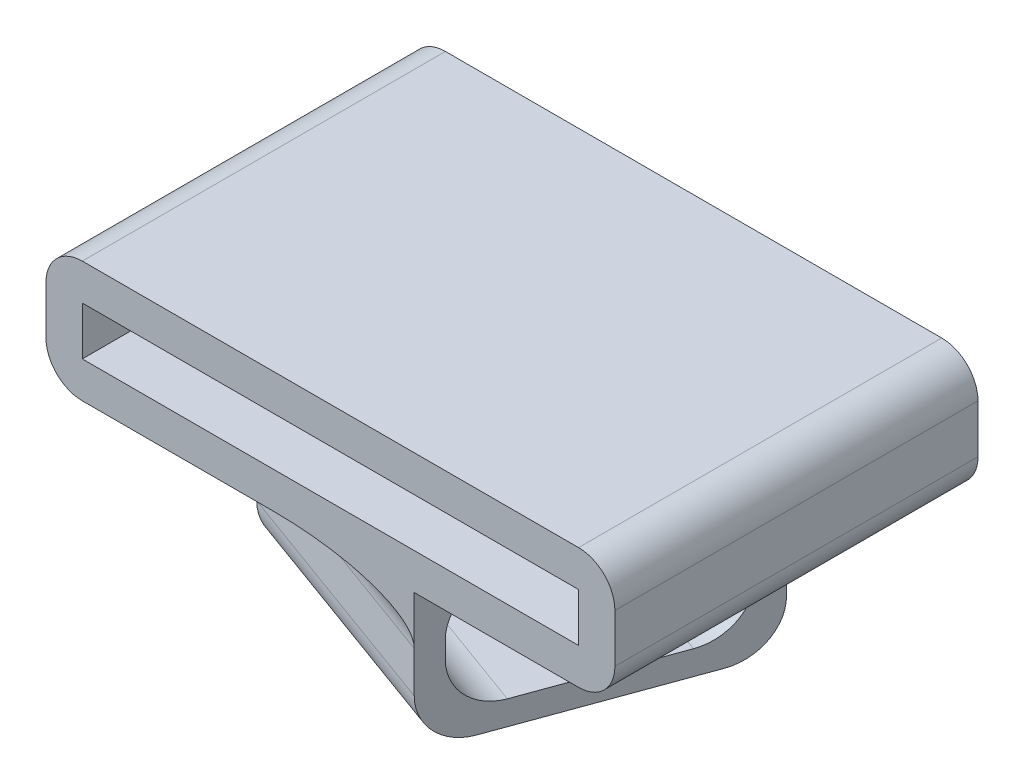
ISO-10303-21;
HEADER;
FILE_DESCRIPTION(('STEP AP214'),'2;1');
FILE_NAME('part.step','',(''),(''),'','','');
FILE_SCHEMA(('AUTOMOTIVE_DESIGN { 1 0 10303 214 1 1 1 1 }'));
ENDSEC;
DATA;
#1=APPLICATION_CONTEXT('core data for automotive mechanical design processes');
#2=APPLICATION_PROTOCOL_DEFINITION('international standard','automotive_design',2000,#1);
#3=PRODUCT_CONTEXT('',#1,'mechanical');
#4=PRODUCT('Part','Part','',(#3));
#5=PRODUCT_RELATED_PRODUCT_CATEGORY('part','',(#4));
#6=PRODUCT_DEFINITION_FORMATION('','',#4);
#7=PRODUCT_DEFINITION_CONTEXT('part definition',#1,'design');
#8=PRODUCT_DEFINITION('design','',#6,#7);
#9=PRODUCT_DEFINITION_SHAPE('','',#8);
#10=(LENGTH_UNIT() NAMED_UNIT(*) SI_UNIT(.MILLI.,.METRE.));
#11=(NAMED_UNIT(*) PLANE_ANGLE_UNIT() SI_UNIT($,.RADIAN.));
#12=(NAMED_UNIT(*) SI_UNIT($,.STERADIAN.) SOLID_ANGLE_UNIT());
#13=UNCERTAINTY_MEASURE_WITH_UNIT(LENGTH_MEASURE(1.E-05),#10,'distance_accuracy_value','');
#14=(GEOMETRIC_REPRESENTATION_CONTEXT(3) GLOBAL_UNCERTAINTY_ASSIGNED_CONTEXT((#13)) GLOBAL_UNIT_ASSIGNED_CONTEXT((#10,
#11,#12)) REPRESENTATION_CONTEXT('',''));
#15=CARTESIAN_POINT('',(0.,0.,0.));
#16=DIRECTION('',(0.,0.,1.));
#17=DIRECTION('',(1.,0.,0.));
#18=AXIS2_PLACEMENT_3D('',#15,#16,#17);
#19=CARTESIAN_POINT('',(1.5,-1.5,15.));
#20=DIRECTION('',(0.,1.,0.));
#21=DIRECTION('',(0.,0.,1.));
#22=AXIS2_PLACEMENT_3D('',#19,#20,#21);
#23=PLANE('',#22);
#24=DIRECTION('',(1.,0.,0.));
#25=VECTOR('',#24,1.);
#26=CARTESIAN_POINT('',(1.5,-1.5,0.));
#27=LINE('',#26,#25);
#28=CARTESIAN_POINT('',(-7.06692907088986,-1.5,0.));
#29=VERTEX_POINT('',#28);
#30=CARTESIAN_POINT('',(0.,-1.5,0.));
#31=VERTEX_POINT('',#30);
#32=EDGE_CURVE('E239',#29,#31,#27,.T.);
#33=ORIENTED_EDGE('',*,*,#32,.T.);
#34=DIRECTION('',(0.,0.,-1.));
#35=VECTOR('',#34,1.);
#36=CARTESIAN_POINT('',(0.,-1.5,15.));
#37=LINE('',#36,#35);
#38=CARTESIAN_POINT('',(0.,-1.5,15.));
#39=VERTEX_POINT('',#38);
#40=EDGE_CURVE('E435',#31,#39,#37,.F.);
#41=ORIENTED_EDGE('',*,*,#40,.T.);
#42=DIRECTION('',(1.,0.,0.));
#43=VECTOR('',#42,1.);
#44=CARTESIAN_POINT('',(1.5,-1.5,15.));
#45=LINE('',#44,#43);
#46=CARTESIAN_POINT('',(-6.7880293813537,-1.5,15.));
#47=VERTEX_POINT('',#46);
#48=EDGE_CURVE('E319',#47,#39,#45,.T.);
#49=ORIENTED_EDGE('',*,*,#48,.F.);
#50=DIRECTION('',(-0.342020143325666,0.,0.939692620785909));
#51=VECTOR('',#50,1.);
#52=CARTESIAN_POINT('',(-6.7880293813537,-1.5,15.));
#53=LINE('',#52,#51);
#54=CARTESIAN_POINT('',(-5.7619689513767,-1.5,12.1809221376423));
#55=VERTEX_POINT('',#54);
#56=EDGE_CURVE('E264',#55,#47,#53,.T.);
#57=ORIENTED_EDGE('',*,*,#56,.F.);
#58=DIRECTION('',(-0.939692620785909,0.,-0.342020143325666));
#59=VECTOR('',#58,1.);
#60=CARTESIAN_POINT('',(-15.9927191611471,-1.5,8.45723358707318));
#61=LINE('',#60,#59);
#62=CARTESIAN_POINT('',(-15.9927191611471,-1.5,8.45723358707318));
#63=VERTEX_POINT('',#62);
#64=EDGE_CURVE('E360',#55,#63,#61,.T.);
#65=ORIENTED_EDGE('',*,*,#64,.T.);
#66=DIRECTION('',(0.342020143325666,0.,-0.939692620785909));
#67=VECTOR('',#66,1.);
#68=CARTESIAN_POINT('',(-12.9145378712161,-1.5,0.));
#69=LINE('',#68,#67);
#70=CARTESIAN_POINT('',(-17.7028198777754,-1.5,13.1556966910027));
#71=VERTEX_POINT('',#70);
#72=EDGE_CURVE('E261',#71,#63,#69,.T.);
#73=ORIENTED_EDGE('',*,*,#72,.F.);
#74=DIRECTION('',(-0.939692620785909,0.,-0.342020143325666));
#75=VECTOR('',#74,1.);
#76=CARTESIAN_POINT('',(-7.47206966800503,-1.5,16.8793852415718));
#77=LINE('',#76,#75);
#78=CARTESIAN_POINT('',(-12.6356381816799,-1.5,15.));
#79=VERTEX_POINT('',#78);
#80=EDGE_CURVE('E357',#71,#79,#77,.F.);
#81=ORIENTED_EDGE('',*,*,#80,.T.);
#82=CARTESIAN_POINT('',(-20.5,-1.5,15.));
#83=VERTEX_POINT('',#82);
#84=EDGE_CURVE('E316',#83,#79,#45,.T.);
#85=ORIENTED_EDGE('',*,*,#84,.F.);
#86=DIRECTION('',(0.,0.,-1.));
#87=VECTOR('',#86,1.);
#88=CARTESIAN_POINT('',(-20.5,-1.5,15.));
#89=LINE('',#88,#87);
#90=CARTESIAN_POINT('',(-20.5,-1.5,0.));
#91=VERTEX_POINT('',#90);
#92=EDGE_CURVE('E236',#83,#91,#89,.T.);
#93=ORIENTED_EDGE('',*,*,#92,.T.);
#94=CARTESIAN_POINT('',(-12.9145378712161,-1.5,0.));
#95=VERTEX_POINT('',#94);
#96=EDGE_CURVE('E227',#91,#95,#27,.T.);
#97=ORIENTED_EDGE('',*,*,#96,.T.);
#98=CARTESIAN_POINT('',(-13.9405983011931,-1.5,2.81907786235773));
#99=VERTEX_POINT('',#98);
#100=EDGE_CURVE('E232',#99,#95,#69,.T.);
#101=ORIENTED_EDGE('',*,*,#100,.F.);
#102=DIRECTION('',(-0.939692620785909,0.,-0.342020143325666));
#103=VECTOR('',#102,1.);
#104=CARTESIAN_POINT('',(-3.70984809142271,-1.5,6.54276641292682));
#105=LINE('',#104,#103);
#106=CARTESIAN_POINT('',(-3.70984809142271,-1.5,6.54276641292682));
#107=VERTEX_POINT('',#106);
#108=EDGE_CURVE('E363',#99,#107,#105,.F.);
#109=ORIENTED_EDGE('',*,*,#108,.T.);
#110=CARTESIAN_POINT('',(-1.99974737479438,-1.5,1.84430330899727));
#111=VERTEX_POINT('',#110);
#112=EDGE_CURVE('E272',#111,#107,#53,.T.);
#113=ORIENTED_EDGE('',*,*,#112,.F.);
#114=DIRECTION('',(0.939692620785909,0.,0.342020143325666));
#115=VECTOR('',#114,1.);
#116=CARTESIAN_POINT('',(-12.2304975845648,-1.5,-1.87938524157182));
#117=LINE('',#116,#115);
#118=EDGE_CURVE('E365',#111,#29,#117,.F.);
#119=ORIENTED_EDGE('',*,*,#118,.T.);
#120=EDGE_LOOP('',(#33,#41,#49,#57,#65,#73,#81,#85,#93,#97,#101,#109,#113,#119));
#121=FACE_BOUND('',#120,.T.);
#122=ADVANCED_FACE('F35',(#121),#23,.F.);
#123=CARTESIAN_POINT('',(0.,0.,15.));
#124=DIRECTION('',(0.,0.,-1.));
#125=DIRECTION('',(-1.,0.,0.));
#126=AXIS2_PLACEMENT_3D('',#123,#124,#125);
#127=PLANE('',#126);
#128=DIRECTION('',(0.,1.,0.));
#129=VECTOR('',#128,1.);
#130=CARTESIAN_POINT('',(1.5,-1.5,15.));
#131=LINE('',#130,#129);
#132=CARTESIAN_POINT('',(1.5,0.,15.));
#133=VERTEX_POINT('',#132);
#134=CARTESIAN_POINT('',(1.5,2.,15.));
#135=VERTEX_POINT('',#134);
#136=EDGE_CURVE('E318',#133,#135,#131,.T.);
#137=ORIENTED_EDGE('',*,*,#136,.T.);
#138=CARTESIAN_POINT('',(0.,2.,15.));
#139=DIRECTION('',(0.,0.,-1.));
#140=DIRECTION('',(-1.,0.,0.));
#141=AXIS2_PLACEMENT_3D('',#138,#139,#140);
#142=CIRCLE('',#141,1.5);
#143=CARTESIAN_POINT('',(0.,3.5,15.));
#144=VERTEX_POINT('',#143);
#145=EDGE_CURVE('E432',#135,#144,#142,.F.);
#146=ORIENTED_EDGE('',*,*,#145,.T.);
#147=DIRECTION('',(-1.,0.,0.));
#148=VECTOR('',#147,1.);
#149=CARTESIAN_POINT('',(1.5,3.5,15.));
#150=LINE('',#149,#148);
#151=CARTESIAN_POINT('',(-20.5,3.5,15.));
#152=VERTEX_POINT('',#151);
#153=EDGE_CURVE('E322',#144,#152,#150,.T.);
#154=ORIENTED_EDGE('',*,*,#153,.T.);
#155=CARTESIAN_POINT('',(-20.5,2.,15.));
#156=DIRECTION('',(0.,0.,-1.));
#157=DIRECTION('',(-1.,0.,0.));
#158=AXIS2_PLACEMENT_3D('',#155,#156,#157);
#159=CIRCLE('',#158,1.5);
#160=CARTESIAN_POINT('',(-22.,2.,15.));
#161=VERTEX_POINT('',#160);
#162=EDGE_CURVE('E56',#152,#161,#159,.F.);
#163=ORIENTED_EDGE('',*,*,#162,.T.);
#164=DIRECTION('',(0.,-1.,0.));
#165=VECTOR('',#164,1.);
#166=CARTESIAN_POINT('',(-22.,-1.5,15.));
#167=LINE('',#166,#165);
#168=CARTESIAN_POINT('',(-22.,0.,15.));
#169=VERTEX_POINT('',#168);
#170=EDGE_CURVE('E324',#161,#169,#167,.T.);
#171=ORIENTED_EDGE('',*,*,#170,.T.);
#172=CARTESIAN_POINT('',(-20.5,0.,15.));
#173=DIRECTION('',(0.,0.,-1.));
#174=DIRECTION('',(-1.,0.,0.));
#175=AXIS2_PLACEMENT_3D('',#172,#173,#174);
#176=CIRCLE('',#175,1.5);
#177=EDGE_CURVE('E427',#169,#83,#176,.F.);
#178=ORIENTED_EDGE('',*,*,#177,.T.);
#179=ORIENTED_EDGE('',*,*,#84,.T.);
#180=CARTESIAN_POINT('',(-12.6356381816799,-3.5,15.));
#181=DIRECTION('',(0.,0.,-1.));
#182=DIRECTION('',(1.,0.,0.));
#183=AXIS2_PLACEMENT_3D('',#180,#181,#182);
#184=ELLIPSE('',#183,5.84760880032622,2.);
#185=CARTESIAN_POINT('',(-6.7880293813537,-3.5,15.));
#186=VERTEX_POINT('',#185);
#187=EDGE_CURVE('E254',#79,#186,#184,.T.);
#188=ORIENTED_EDGE('',*,*,#187,.T.);
#189=DIRECTION('',(0.,-1.,0.));
#190=VECTOR('',#189,1.);
#191=CARTESIAN_POINT('',(-6.7880293813537,-7.2,15.));
#192=LINE('',#191,#190);
#193=EDGE_CURVE('E253',#47,#186,#192,.T.);
#194=ORIENTED_EDGE('',*,*,#193,.F.);
#195=ORIENTED_EDGE('',*,*,#48,.T.);
#196=CARTESIAN_POINT('',(0.,0.,15.));
#197=DIRECTION('',(0.,0.,-1.));
#198=DIRECTION('',(-1.,0.,0.));
#199=AXIS2_PLACEMENT_3D('',#196,#197,#198);
#200=CIRCLE('',#199,1.5);
#201=EDGE_CURVE('E430',#39,#133,#200,.F.);
#202=ORIENTED_EDGE('',*,*,#201,.T.);
#203=EDGE_LOOP('',(#137,#146,#154,#163,#171,#178,#179,#188,#194,#195,#202));
#204=FACE_BOUND('',#203,.T.);
#205=DIRECTION('',(0.,1.,0.));
#206=VECTOR('',#205,1.);
#207=CARTESIAN_POINT('',(0.,0.,15.));
#208=LINE('',#207,#206);
#209=CARTESIAN_POINT('',(0.,0.,15.));
#210=VERTEX_POINT('',#209);
#211=CARTESIAN_POINT('',(0.,2.,15.));
#212=VERTEX_POINT('',#211);
#213=EDGE_CURVE('E286',#210,#212,#208,.T.);
#214=ORIENTED_EDGE('',*,*,#213,.F.);
#215=DIRECTION('',(1.,0.,0.));
#216=VECTOR('',#215,1.);
#217=CARTESIAN_POINT('',(0.,0.,15.));
#218=LINE('',#217,#216);
#219=CARTESIAN_POINT('',(-20.5,0.,15.));
#220=VERTEX_POINT('',#219);
#221=EDGE_CURVE('E294',#220,#210,#218,.T.);
#222=ORIENTED_EDGE('',*,*,#221,.F.);
#223=DIRECTION('',(0.,-1.,0.));
#224=VECTOR('',#223,1.);
#225=CARTESIAN_POINT('',(-20.5,0.,15.));
#226=LINE('',#225,#224);
#227=CARTESIAN_POINT('',(-20.5,2.,15.));
#228=VERTEX_POINT('',#227);
#229=EDGE_CURVE('E291',#228,#220,#226,.T.);
#230=ORIENTED_EDGE('',*,*,#229,.F.);
#231=DIRECTION('',(-1.,0.,0.));
#232=VECTOR('',#231,1.);
#233=CARTESIAN_POINT('',(0.,2.,15.));
#234=LINE('',#233,#232);
#235=EDGE_CURVE('E288',#212,#228,#234,.T.);
#236=ORIENTED_EDGE('',*,*,#235,.F.);
#237=EDGE_LOOP('',(#214,#222,#230,#236));
#238=FACE_BOUND('',#237,.T.);
#239=ADVANCED_FACE('F441',(#204,#238),#127,.F.);
#240=CARTESIAN_POINT('',(0.,0.,0.));
#241=DIRECTION('',(0.,0.,-1.));
#242=DIRECTION('',(-1.,0.,0.));
#243=AXIS2_PLACEMENT_3D('',#240,#241,#242);
#244=PLANE('',#243);
#245=DIRECTION('',(-1.,0.,0.));
#246=VECTOR('',#245,1.);
#247=CARTESIAN_POINT('',(1.5,3.5,0.));
#248=LINE('',#247,#246);
#249=CARTESIAN_POINT('',(0.,3.5,0.));
#250=VERTEX_POINT('',#249);
#251=CARTESIAN_POINT('',(-20.5,3.5,0.));
#252=VERTEX_POINT('',#251);
#253=EDGE_CURVE('E329',#250,#252,#248,.T.);
#254=ORIENTED_EDGE('',*,*,#253,.F.);
#255=CARTESIAN_POINT('',(0.,2.,0.));
#256=DIRECTION('',(0.,0.,-1.));
#257=DIRECTION('',(-1.,0.,0.));
#258=AXIS2_PLACEMENT_3D('',#255,#256,#257);
#259=CIRCLE('',#258,1.5);
#260=CARTESIAN_POINT('',(1.5,2.,0.));
#261=VERTEX_POINT('',#260);
#262=EDGE_CURVE('E420',#250,#261,#259,.T.);
#263=ORIENTED_EDGE('',*,*,#262,.T.);
#264=DIRECTION('',(0.,1.,0.));
#265=VECTOR('',#264,1.);
#266=CARTESIAN_POINT('',(1.5,-1.5,0.));
#267=LINE('',#266,#265);
#268=CARTESIAN_POINT('',(1.5,0.,0.));
#269=VERTEX_POINT('',#268);
#270=EDGE_CURVE('E238',#269,#261,#267,.T.);
#271=ORIENTED_EDGE('',*,*,#270,.F.);
#272=CARTESIAN_POINT('',(0.,0.,0.));
#273=DIRECTION('',(0.,0.,-1.));
#274=DIRECTION('',(-1.,0.,0.));
#275=AXIS2_PLACEMENT_3D('',#272,#273,#274);
#276=CIRCLE('',#275,1.5);
#277=EDGE_CURVE('E418',#269,#31,#276,.T.);
#278=ORIENTED_EDGE('',*,*,#277,.T.);
#279=ORIENTED_EDGE('',*,*,#32,.F.);
#280=CARTESIAN_POINT('',(-7.06692907088986,-3.5,0.));
#281=DIRECTION('',(0.,0.,-1.));
#282=DIRECTION('',(-1.,0.,0.));
#283=AXIS2_PLACEMENT_3D('',#280,#281,#282);
#284=ELLIPSE('',#283,5.84760880032622,2.);
#285=CARTESIAN_POINT('',(-12.9145378712161,-3.5,0.));
#286=VERTEX_POINT('',#285);
#287=EDGE_CURVE('E249',#29,#286,#284,.F.);
#288=ORIENTED_EDGE('',*,*,#287,.T.);
#289=DIRECTION('',(0.,-1.,0.));
#290=VECTOR('',#289,1.);
#291=CARTESIAN_POINT('',(-12.9145378712161,0.,0.));
#292=LINE('',#291,#290);
#293=EDGE_CURVE('E243',#95,#286,#292,.T.);
#294=ORIENTED_EDGE('',*,*,#293,.F.);
#295=ORIENTED_EDGE('',*,*,#96,.F.);
#296=CARTESIAN_POINT('',(-20.5,0.,0.));
#297=DIRECTION('',(0.,0.,-1.));
#298=DIRECTION('',(-1.,0.,0.));
#299=AXIS2_PLACEMENT_3D('',#296,#297,#298);
#300=CIRCLE('',#299,1.5);
#301=CARTESIAN_POINT('',(-22.,0.,0.));
#302=VERTEX_POINT('',#301);
#303=EDGE_CURVE('E414',#91,#302,#300,.T.);
#304=ORIENTED_EDGE('',*,*,#303,.T.);
#305=DIRECTION('',(0.,-1.,0.));
#306=VECTOR('',#305,1.);
#307=CARTESIAN_POINT('',(-22.,-1.5,0.));
#308=LINE('',#307,#306);
#309=CARTESIAN_POINT('',(-22.,2.,0.));
#310=VERTEX_POINT('',#309);
#311=EDGE_CURVE('E332',#310,#302,#308,.T.);
#312=ORIENTED_EDGE('',*,*,#311,.F.);
#313=CARTESIAN_POINT('',(-20.5,2.,0.));
#314=DIRECTION('',(0.,0.,-1.));
#315=DIRECTION('',(-1.,0.,0.));
#316=AXIS2_PLACEMENT_3D('',#313,#314,#315);
#317=CIRCLE('',#316,1.5);
#318=EDGE_CURVE('E416',#310,#252,#317,.T.);
#319=ORIENTED_EDGE('',*,*,#318,.T.);
#320=EDGE_LOOP('',(#254,#263,#271,#278,#279,#288,#294,#295,#304,#312,#319));
#321=FACE_BOUND('',#320,.T.);
#322=DIRECTION('',(1.,0.,0.));
#323=VECTOR('',#322,1.);
#324=CARTESIAN_POINT('',(0.,0.,0.));
#325=LINE('',#324,#323);
#326=CARTESIAN_POINT('',(-20.5,0.,0.));
#327=VERTEX_POINT('',#326);
#328=CARTESIAN_POINT('',(0.,0.,0.));
#329=VERTEX_POINT('',#328);
#330=EDGE_CURVE('E289',#327,#329,#325,.T.);
#331=ORIENTED_EDGE('',*,*,#330,.T.);
#332=DIRECTION('',(0.,1.,0.));
#333=VECTOR('',#332,1.);
#334=CARTESIAN_POINT('',(0.,0.,0.));
#335=LINE('',#334,#333);
#336=CARTESIAN_POINT('',(0.,2.,0.));
#337=VERTEX_POINT('',#336);
#338=EDGE_CURVE('E285',#329,#337,#335,.T.);
#339=ORIENTED_EDGE('',*,*,#338,.T.);
#340=DIRECTION('',(-1.,0.,0.));
#341=VECTOR('',#340,1.);
#342=CARTESIAN_POINT('',(0.,2.,0.));
#343=LINE('',#342,#341);
#344=CARTESIAN_POINT('',(-20.5,2.,0.));
#345=VERTEX_POINT('',#344);
#346=EDGE_CURVE('E299',#337,#345,#343,.T.);
#347=ORIENTED_EDGE('',*,*,#346,.T.);
#348=DIRECTION('',(0.,-1.,0.));
#349=VECTOR('',#348,1.);
#350=CARTESIAN_POINT('',(-20.5,0.,0.));
#351=LINE('',#350,#349);
#352=EDGE_CURVE('E302',#345,#327,#351,.T.);
#353=ORIENTED_EDGE('',*,*,#352,.T.);
#354=EDGE_LOOP('',(#331,#339,#347,#353));
#355=FACE_BOUND('',#354,.T.);
#356=ADVANCED_FACE('F245',(#321,#355),#244,.T.);
#357=CARTESIAN_POINT('',(1.5,-1.5,15.));
#358=DIRECTION('',(-1.,0.,0.));
#359=DIRECTION('',(0.,0.,1.));
#360=AXIS2_PLACEMENT_3D('',#357,#358,#359);
#361=PLANE('',#360);
#362=ORIENTED_EDGE('',*,*,#270,.T.);
#363=DIRECTION('',(0.,0.,-1.));
#364=VECTOR('',#363,1.);
#365=CARTESIAN_POINT('',(1.5,2.,15.));
#366=LINE('',#365,#364);
#367=EDGE_CURVE('E425',#261,#135,#366,.F.);
#368=ORIENTED_EDGE('',*,*,#367,.T.);
#369=ORIENTED_EDGE('',*,*,#136,.F.);
#370=DIRECTION('',(0.,0.,-1.));
#371=VECTOR('',#370,1.);
#372=CARTESIAN_POINT('',(1.5,0.,15.));
#373=LINE('',#372,#371);
#374=EDGE_CURVE('E422',#133,#269,#373,.T.);
#375=ORIENTED_EDGE('',*,*,#374,.T.);
#376=EDGE_LOOP('',(#362,#368,#369,#375));
#377=FACE_BOUND('',#376,.T.);
#378=ADVANCED_FACE('F449',(#377),#361,.F.);
#379=CARTESIAN_POINT('',(1.5,3.5,15.));
#380=DIRECTION('',(0.,-1.,0.));
#381=DIRECTION('',(1.,0.,0.));
#382=AXIS2_PLACEMENT_3D('',#379,#380,#381);
#383=PLANE('',#382);
#384=ORIENTED_EDGE('',*,*,#153,.F.);
#385=DIRECTION('',(0.,0.,-1.));
#386=VECTOR('',#385,1.);
#387=CARTESIAN_POINT('',(0.,3.5,15.));
#388=LINE('',#387,#386);
#389=EDGE_CURVE('E411',#144,#250,#388,.T.);
#390=ORIENTED_EDGE('',*,*,#389,.T.);
#391=ORIENTED_EDGE('',*,*,#253,.T.);
#392=DIRECTION('',(0.,0.,-1.));
#393=VECTOR('',#392,1.);
#394=CARTESIAN_POINT('',(-20.5,3.5,15.));
#395=LINE('',#394,#393);
#396=EDGE_CURVE('E409',#252,#152,#395,.F.);
#397=ORIENTED_EDGE('',*,*,#396,.T.);
#398=EDGE_LOOP('',(#384,#390,#391,#397));
#399=FACE_BOUND('',#398,.T.);
#400=ADVANCED_FACE('F457',(#399),#383,.F.);
#401=CARTESIAN_POINT('',(-22.,-1.5,15.));
#402=DIRECTION('',(1.,0.,0.));
#403=DIRECTION('',(0.,0.,-1.));
#404=AXIS2_PLACEMENT_3D('',#401,#402,#403);
#405=PLANE('',#404);
#406=ORIENTED_EDGE('',*,*,#170,.F.);
#407=DIRECTION('',(0.,0.,-1.));
#408=VECTOR('',#407,1.);
#409=CARTESIAN_POINT('',(-22.,2.,15.));
#410=LINE('',#409,#408);
#411=EDGE_CURVE('E11',#161,#310,#410,.T.);
#412=ORIENTED_EDGE('',*,*,#411,.T.);
#413=ORIENTED_EDGE('',*,*,#311,.T.);
#414=DIRECTION('',(0.,0.,-1.));
#415=VECTOR('',#414,1.);
#416=CARTESIAN_POINT('',(-22.,0.,15.));
#417=LINE('',#416,#415);
#418=EDGE_CURVE('E43',#302,#169,#417,.F.);
#419=ORIENTED_EDGE('',*,*,#418,.T.);
#420=EDGE_LOOP('',(#406,#412,#413,#419));
#421=FACE_BOUND('',#420,.T.);
#422=ADVANCED_FACE('F463',(#421),#405,.F.);
#423=CARTESIAN_POINT('',(0.,0.,15.));
#424=DIRECTION('',(-1.,0.,0.));
#425=DIRECTION('',(0.,-1.,0.));
#426=AXIS2_PLACEMENT_3D('',#423,#424,#425);
#427=PLANE('',#426);
#428=ORIENTED_EDGE('',*,*,#338,.F.);
#429=DIRECTION('',(0.,0.,-1.));
#430=VECTOR('',#429,1.);
#431=CARTESIAN_POINT('',(0.,0.,15.));
#432=LINE('',#431,#430);
#433=EDGE_CURVE('E296',#210,#329,#432,.T.);
#434=ORIENTED_EDGE('',*,*,#433,.F.);
#435=ORIENTED_EDGE('',*,*,#213,.T.);
#436=DIRECTION('',(0.,0.,-1.));
#437=VECTOR('',#436,1.);
#438=CARTESIAN_POINT('',(0.,2.,15.));
#439=LINE('',#438,#437);
#440=EDGE_CURVE('E313',#212,#337,#439,.T.);
#441=ORIENTED_EDGE('',*,*,#440,.T.);
#442=EDGE_LOOP('',(#428,#434,#435,#441));
#443=FACE_BOUND('',#442,.T.);
#444=ADVANCED_FACE('F594',(#443),#427,.T.);
#445=CARTESIAN_POINT('',(0.,2.,15.));
#446=DIRECTION('',(0.,-1.,0.));
#447=DIRECTION('',(1.,0.,0.));
#448=AXIS2_PLACEMENT_3D('',#445,#446,#447);
#449=PLANE('',#448);
#450=ORIENTED_EDGE('',*,*,#346,.F.);
#451=ORIENTED_EDGE('',*,*,#440,.F.);
#452=ORIENTED_EDGE('',*,*,#235,.T.);
#453=DIRECTION('',(0.,0.,-1.));
#454=VECTOR('',#453,1.);
#455=CARTESIAN_POINT('',(-20.5,2.,15.));
#456=LINE('',#455,#454);
#457=EDGE_CURVE('E311',#228,#345,#456,.T.);
#458=ORIENTED_EDGE('',*,*,#457,.T.);
#459=EDGE_LOOP('',(#450,#451,#452,#458));
#460=FACE_BOUND('',#459,.T.);
#461=ADVANCED_FACE('F753',(#460),#449,.T.);
#462=CARTESIAN_POINT('',(-20.5,0.,15.));
#463=DIRECTION('',(1.,0.,0.));
#464=DIRECTION('',(0.,0.,-1.));
#465=AXIS2_PLACEMENT_3D('',#462,#463,#464);
#466=PLANE('',#465);
#467=ORIENTED_EDGE('',*,*,#352,.F.);
#468=ORIENTED_EDGE('',*,*,#457,.F.);
#469=ORIENTED_EDGE('',*,*,#229,.T.);
#470=DIRECTION('',(0.,0.,-1.));
#471=VECTOR('',#470,1.);
#472=CARTESIAN_POINT('',(-20.5,0.,15.));
#473=LINE('',#472,#471);
#474=EDGE_CURVE('E309',#220,#327,#473,.T.);
#475=ORIENTED_EDGE('',*,*,#474,.T.);
#476=EDGE_LOOP('',(#467,#468,#469,#475));
#477=FACE_BOUND('',#476,.T.);
#478=ADVANCED_FACE('F520',(#477),#466,.T.);
#479=CARTESIAN_POINT('',(0.,0.,15.));
#480=DIRECTION('',(0.,1.,0.));
#481=DIRECTION('',(-1.,0.,0.));
#482=AXIS2_PLACEMENT_3D('',#479,#480,#481);
#483=PLANE('',#482);
#484=ORIENTED_EDGE('',*,*,#330,.F.);
#485=ORIENTED_EDGE('',*,*,#474,.F.);
#486=ORIENTED_EDGE('',*,*,#221,.T.);
#487=ORIENTED_EDGE('',*,*,#433,.T.);
#488=EDGE_LOOP('',(#484,#485,#486,#487));
#489=FACE_BOUND('',#488,.T.);
#490=ADVANCED_FACE('F512',(#489),#483,.T.);
#491=CARTESIAN_POINT('',(-17.0187795911241,-7.2,11.2763114494309));
#492=DIRECTION('',(0.342020143325666,0.,-0.939692620785909));
#493=DIRECTION('',(-0.939692620785909,0.,-0.342020143325666));
#494=AXIS2_PLACEMENT_3D('',#491,#492,#493);
#495=PLANE('',#494);
#496=DIRECTION('',(0.,1.,0.));
#497=VECTOR('',#496,1.);
#498=CARTESIAN_POINT('',(-17.0187795911241,-7.2,11.2763114494309));
#499=LINE('',#498,#497);
#500=CARTESIAN_POINT('',(-17.0187795911241,-5.2,11.2763114494309));
#501=VERTEX_POINT('',#500);
#502=CARTESIAN_POINT('',(-17.0187795911241,-3.5,11.2763114494309));
#503=VERTEX_POINT('',#502);
#504=EDGE_CURVE('E282',#501,#503,#499,.T.);
#505=ORIENTED_EDGE('',*,*,#504,.F.);
#506=DIRECTION('',(-0.939692620785909,0.,-0.342020143325666));
#507=VECTOR('',#506,1.);
#508=CARTESIAN_POINT('',(-17.0187795911241,-5.2,11.2763114494309));
#509=LINE('',#508,#507);
#510=CARTESIAN_POINT('',(-6.7880293813537,-5.2,15.));
#511=VERTEX_POINT('',#510);
#512=EDGE_CURVE('E346',#501,#511,#509,.F.);
#513=ORIENTED_EDGE('',*,*,#512,.T.);
#514=DIRECTION('',(0.,1.,0.));
#515=VECTOR('',#514,1.);
#516=CARTESIAN_POINT('',(-6.7880293813537,-7.2,15.));
#517=LINE('',#516,#515);
#518=EDGE_CURVE('E275',#511,#186,#517,.T.);
#519=ORIENTED_EDGE('',*,*,#518,.T.);
#520=DIRECTION('',(-0.939692620785909,0.,-0.342020143325666));
#521=VECTOR('',#520,1.);
#522=CARTESIAN_POINT('',(-17.0187795911241,-3.5,11.2763114494309));
#523=LINE('',#522,#521);
#524=EDGE_CURVE('E343',#186,#503,#523,.T.);
#525=ORIENTED_EDGE('',*,*,#524,.T.);
#526=EDGE_LOOP('',(#505,#513,#519,#525));
#527=FACE_BOUND('',#526,.T.);
#528=ADVANCED_FACE('F510',(#527),#495,.F.);
#529=CARTESIAN_POINT('',(-12.9145378712161,-7.2,0.));
#530=DIRECTION('',(0.939692620785909,0.,0.342020143325666));
#531=DIRECTION('',(0.342020143325666,0.,-0.939692620785909));
#532=AXIS2_PLACEMENT_3D('',#529,#530,#531);
#533=PLANE('',#532);
#534=DIRECTION('',(0.342020143325666,0.,-0.939692620785909));
#535=VECTOR('',#534,1.);
#536=CARTESIAN_POINT('',(-12.9145378712161,-7.2,0.));
#537=LINE('',#536,#535);
#538=CARTESIAN_POINT('',(-16.3347393044727,-7.2,9.39692620785909));
#539=VERTEX_POINT('',#538);
#540=CARTESIAN_POINT('',(-13.5985781578674,-7.2,1.87938524157182));
#541=VERTEX_POINT('',#540);
#542=EDGE_CURVE('E274',#539,#541,#537,.T.);
#543=ORIENTED_EDGE('',*,*,#542,.F.);
#544=CARTESIAN_POINT('',(-16.3347393044727,-5.2,9.39692620785909));
#545=DIRECTION('',(0.939692620785909,0.,0.342020143325666));
#546=DIRECTION('',(0.342020143325666,0.,-0.939692620785909));
#547=AXIS2_PLACEMENT_3D('',#544,#545,#546);
#548=CIRCLE('',#547,2.);
#549=EDGE_CURVE('E341',#539,#501,#548,.F.);
#550=ORIENTED_EDGE('',*,*,#549,.T.);
#551=ORIENTED_EDGE('',*,*,#504,.T.);
#552=CARTESIAN_POINT('',(-17.7028198777754,-3.5,13.1556966910027));
#553=DIRECTION('',(0.939692620785909,0.,0.342020143325666));
#554=DIRECTION('',(0.342020143325666,0.,-0.939692620785909));
#555=AXIS2_PLACEMENT_3D('',#552,#553,#554);
#556=CIRCLE('',#555,2.);
#557=EDGE_CURVE('E402',#503,#71,#556,.T.);
#558=ORIENTED_EDGE('',*,*,#557,.T.);
#559=ORIENTED_EDGE('',*,*,#72,.T.);
#560=CARTESIAN_POINT('',(-15.9927191611471,-3.5,8.45723358707318));
#561=DIRECTION('',(0.939692620785909,0.,0.342020143325666));
#562=DIRECTION('',(0.342020143325666,0.,-0.939692620785909));
#563=AXIS2_PLACEMENT_3D('',#560,#561,#562);
#564=CIRCLE('',#563,2.);
#565=CARTESIAN_POINT('',(-16.6767594477984,-3.5,10.336618828645));
#566=VERTEX_POINT('',#565);
#567=EDGE_CURVE('E397',#63,#566,#564,.T.);
#568=ORIENTED_EDGE('',*,*,#567,.T.);
#569=DIRECTION('',(0.,1.,0.));
#570=VECTOR('',#569,1.);
#571=CARTESIAN_POINT('',(-16.6767594477984,-6.2,10.336618828645));
#572=LINE('',#571,#570);
#573=CARTESIAN_POINT('',(-16.6767594477984,-4.2,10.336618828645));
#574=VERTEX_POINT('',#573);
#575=EDGE_CURVE('E484',#574,#566,#572,.T.);
#576=ORIENTED_EDGE('',*,*,#575,.F.);
#577=CARTESIAN_POINT('',(-15.9927191611471,-4.2,8.45723358707318));
#578=DIRECTION('',(0.939692620785909,0.,0.342020143325666));
#579=DIRECTION('',(0.342020143325666,0.,-0.939692620785909));
#580=AXIS2_PLACEMENT_3D('',#577,#578,#579);
#581=CIRCLE('',#580,2.);
#582=CARTESIAN_POINT('',(-15.9927191611471,-6.2,8.45723358707318));
#583=VERTEX_POINT('',#582);
#584=EDGE_CURVE('E390',#574,#583,#581,.T.);
#585=ORIENTED_EDGE('',*,*,#584,.T.);
#586=DIRECTION('',(-0.342020143325666,0.,0.939692620785909));
#587=VECTOR('',#586,1.);
#588=CARTESIAN_POINT('',(-16.6767594477984,-6.2,10.336618828645));
#589=LINE('',#588,#587);
#590=CARTESIAN_POINT('',(-13.9405983011931,-6.2,2.81907786235773));
#591=VERTEX_POINT('',#590);
#592=EDGE_CURVE('E492',#591,#583,#589,.T.);
#593=ORIENTED_EDGE('',*,*,#592,.F.);
#594=CARTESIAN_POINT('',(-13.9405983011931,-4.2,2.81907786235773));
#595=DIRECTION('',(0.939692620785909,0.,0.342020143325666));
#596=DIRECTION('',(0.342020143325666,0.,-0.939692620785909));
#597=AXIS2_PLACEMENT_3D('',#594,#595,#596);
#598=CIRCLE('',#597,2.);
#599=CARTESIAN_POINT('',(-13.2565580145418,-4.2,0.939692620785909));
#600=VERTEX_POINT('',#599);
#601=EDGE_CURVE('E386',#591,#600,#598,.T.);
#602=ORIENTED_EDGE('',*,*,#601,.T.);
#603=DIRECTION('',(0.,-1.,0.));
#604=VECTOR('',#603,1.);
#605=CARTESIAN_POINT('',(-13.2565580145418,-6.2,0.939692620785909));
#606=LINE('',#605,#604);
#607=CARTESIAN_POINT('',(-13.2565580145418,-3.5,0.939692620785909));
#608=VERTEX_POINT('',#607);
#609=EDGE_CURVE('E489',#608,#600,#606,.T.);
#610=ORIENTED_EDGE('',*,*,#609,.F.);
#611=CARTESIAN_POINT('',(-13.9405983011931,-3.5,2.81907786235773));
#612=DIRECTION('',(0.939692620785909,0.,0.342020143325666));
#613=DIRECTION('',(0.342020143325666,0.,-0.939692620785909));
#614=AXIS2_PLACEMENT_3D('',#611,#612,#613);
#615=CIRCLE('',#614,2.);
#616=EDGE_CURVE('E259',#608,#99,#615,.T.);
#617=ORIENTED_EDGE('',*,*,#616,.T.);
#618=ORIENTED_EDGE('',*,*,#100,.T.);
#619=ORIENTED_EDGE('',*,*,#293,.T.);
#620=DIRECTION('',(0.,1.,0.));
#621=VECTOR('',#620,1.);
#622=CARTESIAN_POINT('',(-12.9145378712161,-7.2,0.));
#623=LINE('',#622,#621);
#624=CARTESIAN_POINT('',(-12.9145378712161,-5.2,0.));
#625=VERTEX_POINT('',#624);
#626=EDGE_CURVE('E280',#625,#286,#623,.T.);
#627=ORIENTED_EDGE('',*,*,#626,.F.);
#628=CARTESIAN_POINT('',(-13.5985781578674,-5.2,1.87938524157182));
#629=DIRECTION('',(0.939692620785909,0.,0.342020143325666));
#630=DIRECTION('',(0.342020143325666,0.,-0.939692620785909));
#631=AXIS2_PLACEMENT_3D('',#628,#629,#630);
#632=CIRCLE('',#631,2.);
#633=EDGE_CURVE('E339',#625,#541,#632,.F.);
#634=ORIENTED_EDGE('',*,*,#633,.T.);
#635=EDGE_LOOP('',(#543,#550,#551,#558,#559,#568,#576,#585,#593,#602,#610,#617,#618,#619,#627,#634));
#636=FACE_BOUND('',#635,.T.);
#637=ADVANCED_FACE('F257',(#636),#533,.F.);
#638=CARTESIAN_POINT('',(-2.68378766144571,-7.2,3.72368855056909));
#639=DIRECTION('',(-0.342020143325666,0.,0.939692620785909));
#640=DIRECTION('',(0.939692620785909,0.,0.342020143325666));
#641=AXIS2_PLACEMENT_3D('',#638,#639,#640);
#642=PLANE('',#641);
#643=DIRECTION('',(0.,1.,0.));
#644=VECTOR('',#643,1.);
#645=CARTESIAN_POINT('',(-2.68378766144571,-7.2,3.72368855056909));
#646=LINE('',#645,#644);
#647=CARTESIAN_POINT('',(-2.68378766144571,-5.2,3.72368855056909));
#648=VERTEX_POINT('',#647);
#649=CARTESIAN_POINT('',(-2.68378766144571,-3.5,3.72368855056909));
#650=VERTEX_POINT('',#649);
#651=EDGE_CURVE('E277',#648,#650,#646,.T.);
#652=ORIENTED_EDGE('',*,*,#651,.F.);
#653=DIRECTION('',(0.939692620785909,0.,0.342020143325666));
#654=VECTOR('',#653,1.);
#655=CARTESIAN_POINT('',(-2.68378766144571,-5.2,3.72368855056909));
#656=LINE('',#655,#654);
#657=EDGE_CURVE('E355',#648,#625,#656,.F.);
#658=ORIENTED_EDGE('',*,*,#657,.T.);
#659=ORIENTED_EDGE('',*,*,#626,.T.);
#660=DIRECTION('',(0.939692620785909,0.,0.342020143325666));
#661=VECTOR('',#660,1.);
#662=CARTESIAN_POINT('',(-2.68378766144571,-3.5,3.72368855056909));
#663=LINE('',#662,#661);
#664=EDGE_CURVE('E352',#286,#650,#663,.T.);
#665=ORIENTED_EDGE('',*,*,#664,.T.);
#666=EDGE_LOOP('',(#652,#658,#659,#665));
#667=FACE_BOUND('',#666,.T.);
#668=ADVANCED_FACE('F518',(#667),#642,.F.);
#669=CARTESIAN_POINT('',(-6.7880293813537,-7.2,15.));
#670=DIRECTION('',(-0.939692620785909,0.,-0.342020143325666));
#671=DIRECTION('',(-0.342020143325666,0.,0.93969262078591));
#672=AXIS2_PLACEMENT_3D('',#669,#670,#671);
#673=PLANE('',#672);
#674=ORIENTED_EDGE('',*,*,#518,.F.);
#675=CARTESIAN_POINT('',(-6.10398909470237,-5.2,13.1206147584282));
#676=DIRECTION('',(-0.939692620785909,0.,-0.342020143325666));
#677=DIRECTION('',(-0.342020143325666,0.,0.93969262078591));
#678=AXIS2_PLACEMENT_3D('',#675,#676,#677);
#679=CIRCLE('',#678,2.);
#680=CARTESIAN_POINT('',(-6.10398909470237,-7.2,13.1206147584282));
#681=VERTEX_POINT('',#680);
#682=EDGE_CURVE('E350',#511,#681,#679,.F.);
#683=ORIENTED_EDGE('',*,*,#682,.T.);
#684=DIRECTION('',(-0.342020143325666,0.,0.939692620785909));
#685=VECTOR('',#684,1.);
#686=CARTESIAN_POINT('',(-6.7880293813537,-7.2,15.));
#687=LINE('',#686,#685);
#688=CARTESIAN_POINT('',(-3.36782794809704,-7.2,5.60307379214091));
#689=VERTEX_POINT('',#688);
#690=EDGE_CURVE('E270',#689,#681,#687,.T.);
#691=ORIENTED_EDGE('',*,*,#690,.F.);
#692=CARTESIAN_POINT('',(-3.36782794809704,-5.2,5.60307379214091));
#693=DIRECTION('',(-0.939692620785909,0.,-0.342020143325666));
#694=DIRECTION('',(-0.342020143325666,0.,0.93969262078591));
#695=AXIS2_PLACEMENT_3D('',#692,#693,#694);
#696=CIRCLE('',#695,2.);
#697=EDGE_CURVE('E348',#689,#648,#696,.F.);
#698=ORIENTED_EDGE('',*,*,#697,.T.);
#699=ORIENTED_EDGE('',*,*,#651,.T.);
#700=CARTESIAN_POINT('',(-1.99974737479438,-3.5,1.84430330899727));
#701=DIRECTION('',(-0.939692620785909,0.,-0.342020143325666));
#702=DIRECTION('',(-0.342020143325666,0.,0.93969262078591));
#703=AXIS2_PLACEMENT_3D('',#700,#701,#702);
#704=CIRCLE('',#703,2.);
#705=EDGE_CURVE('E382',#650,#111,#704,.T.);
#706=ORIENTED_EDGE('',*,*,#705,.T.);
#707=ORIENTED_EDGE('',*,*,#112,.T.);
#708=CARTESIAN_POINT('',(-3.70984809142271,-3.5,6.54276641292682));
#709=DIRECTION('',(-0.939692620785909,0.,-0.342020143325666));
#710=DIRECTION('',(-0.342020143325666,0.,0.93969262078591));
#711=AXIS2_PLACEMENT_3D('',#708,#709,#710);
#712=CIRCLE('',#711,2.);
#713=CARTESIAN_POINT('',(-3.02580780477137,-3.5,4.663381171355));
#714=VERTEX_POINT('',#713);
#715=EDGE_CURVE('E395',#107,#714,#712,.T.);
#716=ORIENTED_EDGE('',*,*,#715,.T.);
#717=DIRECTION('',(0.,-1.,0.));
#718=VECTOR('',#717,1.);
#719=CARTESIAN_POINT('',(-3.02580780477137,-6.2,4.663381171355));
#720=LINE('',#719,#718);
#721=CARTESIAN_POINT('',(-3.02580780477137,-4.2,4.663381171355));
#722=VERTEX_POINT('',#721);
#723=EDGE_CURVE('E266',#714,#722,#720,.T.);
#724=ORIENTED_EDGE('',*,*,#723,.T.);
#725=CARTESIAN_POINT('',(-3.70984809142271,-4.2,6.54276641292682));
#726=DIRECTION('',(-0.939692620785909,0.,-0.342020143325666));
#727=DIRECTION('',(-0.342020143325666,0.,0.93969262078591));
#728=AXIS2_PLACEMENT_3D('',#725,#726,#727);
#729=CIRCLE('',#728,2.);
#730=CARTESIAN_POINT('',(-3.7098480914227,-6.2,6.54276641292682));
#731=VERTEX_POINT('',#730);
#732=EDGE_CURVE('E388',#722,#731,#729,.T.);
#733=ORIENTED_EDGE('',*,*,#732,.T.);
#734=DIRECTION('',(-0.342020143325666,0.,0.939692620785909));
#735=VECTOR('',#734,1.);
#736=CARTESIAN_POINT('',(-6.44600923802803,-6.2,14.0603073792141));
#737=LINE('',#736,#735);
#738=CARTESIAN_POINT('',(-5.7619689513767,-6.2,12.1809221376423));
#739=VERTEX_POINT('',#738);
#740=EDGE_CURVE('E262',#731,#739,#737,.T.);
#741=ORIENTED_EDGE('',*,*,#740,.T.);
#742=CARTESIAN_POINT('',(-5.7619689513767,-4.2,12.1809221376423));
#743=DIRECTION('',(-0.939692620785909,0.,-0.342020143325666));
#744=DIRECTION('',(-0.342020143325666,0.,0.93969262078591));
#745=AXIS2_PLACEMENT_3D('',#742,#743,#744);
#746=CIRCLE('',#745,2.);
#747=CARTESIAN_POINT('',(-6.44600923802803,-4.2,14.0603073792141));
#748=VERTEX_POINT('',#747);
#749=EDGE_CURVE('E392',#739,#748,#746,.T.);
#750=ORIENTED_EDGE('',*,*,#749,.T.);
#751=DIRECTION('',(0.,1.,0.));
#752=VECTOR('',#751,1.);
#753=CARTESIAN_POINT('',(-6.44600923802803,-6.2,14.0603073792141));
#754=LINE('',#753,#752);
#755=CARTESIAN_POINT('',(-6.44600923802803,-3.5,14.0603073792141));
#756=VERTEX_POINT('',#755);
#757=EDGE_CURVE('E497',#748,#756,#754,.T.);
#758=ORIENTED_EDGE('',*,*,#757,.T.);
#759=CARTESIAN_POINT('',(-5.7619689513767,-3.5,12.1809221376423));
#760=DIRECTION('',(-0.939692620785909,0.,-0.342020143325666));
#761=DIRECTION('',(-0.342020143325666,0.,0.93969262078591));
#762=AXIS2_PLACEMENT_3D('',#759,#760,#761);
#763=CIRCLE('',#762,2.);
#764=EDGE_CURVE('E399',#756,#55,#763,.T.);
#765=ORIENTED_EDGE('',*,*,#764,.T.);
#766=ORIENTED_EDGE('',*,*,#56,.T.);
#767=ORIENTED_EDGE('',*,*,#193,.T.);
#768=EDGE_LOOP('',(#674,#683,#691,#698,#699,#706,#707,#716,#724,#733,#741,#750,#758,#765,#766,#767));
#769=FACE_BOUND('',#768,.T.);
#770=ADVANCED_FACE('F473',(#769),#673,.F.);
#771=CARTESIAN_POINT('',(0.,-7.2,0.));
#772=DIRECTION('',(0.,1.,0.));
#773=DIRECTION('',(0.,0.,1.));
#774=AXIS2_PLACEMENT_3D('',#771,#772,#773);
#775=PLANE('',#774);
#776=ORIENTED_EDGE('',*,*,#690,.T.);
#777=DIRECTION('',(-0.939692620785909,0.,-0.342020143325666));
#778=VECTOR('',#777,1.);
#779=CARTESIAN_POINT('',(-4.93091538301734,-7.2,13.5475786720817));
#780=LINE('',#779,#778);
#781=EDGE_CURVE('E336',#681,#539,#780,.T.);
#782=ORIENTED_EDGE('',*,*,#781,.T.);
#783=ORIENTED_EDGE('',*,*,#542,.T.);
#784=DIRECTION('',(0.939692620785909,0.,0.342020143325666));
#785=VECTOR('',#784,1.);
#786=CARTESIAN_POINT('',(-2.19475423641201,-7.2,6.03003770579443));
#787=LINE('',#786,#785);
#788=EDGE_CURVE('E325',#541,#689,#787,.T.);
#789=ORIENTED_EDGE('',*,*,#788,.T.);
#790=EDGE_LOOP('',(#776,#782,#783,#789));
#791=FACE_BOUND('',#790,.T.);
#792=ADVANCED_FACE('F504',(#791),#775,.F.);
#793=CARTESIAN_POINT('',(-6.44600923802803,-6.2,14.0603073792141));
#794=DIRECTION('',(-0.342020143325666,0.,0.939692620785909));
#795=DIRECTION('',(0.939692620785909,0.,0.342020143325666));
#796=AXIS2_PLACEMENT_3D('',#793,#794,#795);
#797=PLANE('',#796);
#798=ORIENTED_EDGE('',*,*,#757,.F.);
#799=DIRECTION('',(-0.939692620785909,0.,-0.342020143325666));
#800=VECTOR('',#799,1.);
#801=CARTESIAN_POINT('',(-16.6767594477984,-4.2,10.336618828645));
#802=LINE('',#801,#800);
#803=EDGE_CURVE('E379',#748,#574,#802,.T.);
#804=ORIENTED_EDGE('',*,*,#803,.T.);
#805=ORIENTED_EDGE('',*,*,#575,.T.);
#806=DIRECTION('',(-0.939692620785909,0.,-0.342020143325666));
#807=VECTOR('',#806,1.);
#808=CARTESIAN_POINT('',(-6.44600923802803,-3.5,14.0603073792141));
#809=LINE('',#808,#807);
#810=EDGE_CURVE('E377',#566,#756,#809,.F.);
#811=ORIENTED_EDGE('',*,*,#810,.T.);
#812=EDGE_LOOP('',(#798,#804,#805,#811));
#813=FACE_BOUND('',#812,.T.);
#814=ADVANCED_FACE('F487',(#813),#797,.F.);
#815=CARTESIAN_POINT('',(-6.44600923802803,-6.2,14.0603073792141));
#816=DIRECTION('',(0.,-1.,0.));
#817=DIRECTION('',(0.,0.,-1.));
#818=AXIS2_PLACEMENT_3D('',#815,#816,#817);
#819=PLANE('',#818);
#820=ORIENTED_EDGE('',*,*,#740,.F.);
#821=DIRECTION('',(-0.939692620785909,0.,-0.342020143325666));
#822=VECTOR('',#821,1.);
#823=CARTESIAN_POINT('',(-13.9405983011931,-6.2,2.81907786235773));
#824=LINE('',#823,#822);
#825=EDGE_CURVE('E369',#731,#591,#824,.T.);
#826=ORIENTED_EDGE('',*,*,#825,.T.);
#827=ORIENTED_EDGE('',*,*,#592,.T.);
#828=DIRECTION('',(-0.939692620785909,0.,-0.342020143325666));
#829=VECTOR('',#828,1.);
#830=CARTESIAN_POINT('',(-5.7619689513767,-6.2,12.1809221376423));
#831=LINE('',#830,#829);
#832=EDGE_CURVE('E367',#583,#739,#831,.F.);
#833=ORIENTED_EDGE('',*,*,#832,.T.);
#834=EDGE_LOOP('',(#820,#826,#827,#833));
#835=FACE_BOUND('',#834,.T.);
#836=ADVANCED_FACE('F687',(#835),#819,.F.);
#837=CARTESIAN_POINT('',(-3.02580780477137,-6.2,4.663381171355));
#838=DIRECTION('',(0.342020143325666,0.,-0.939692620785909));
#839=DIRECTION('',(-0.939692620785909,0.,-0.342020143325666));
#840=AXIS2_PLACEMENT_3D('',#837,#838,#839);
#841=PLANE('',#840);
#842=ORIENTED_EDGE('',*,*,#609,.T.);
#843=DIRECTION('',(-0.939692620785909,0.,-0.342020143325666));
#844=VECTOR('',#843,1.);
#845=CARTESIAN_POINT('',(-3.02580780477137,-4.2,4.663381171355));
#846=LINE('',#845,#844);
#847=EDGE_CURVE('E375',#600,#722,#846,.F.);
#848=ORIENTED_EDGE('',*,*,#847,.T.);
#849=ORIENTED_EDGE('',*,*,#723,.F.);
#850=DIRECTION('',(-0.939692620785909,0.,-0.342020143325666));
#851=VECTOR('',#850,1.);
#852=CARTESIAN_POINT('',(-13.2565580145418,-3.5,0.939692620785909));
#853=LINE('',#852,#851);
#854=EDGE_CURVE('E372',#714,#608,#853,.T.);
#855=ORIENTED_EDGE('',*,*,#854,.T.);
#856=EDGE_LOOP('',(#842,#848,#849,#855));
#857=FACE_BOUND('',#856,.T.);
#858=ADVANCED_FACE('F535',(#857),#841,.F.);
#859=CARTESIAN_POINT('',(-4.93091538301734,-5.2,13.5475786720817));
#860=DIRECTION('',(-0.939692620785909,0.,-0.342020143325666));
#861=DIRECTION('',(-0.342020143325666,0.,0.939692620785909));
#862=AXIS2_PLACEMENT_3D('',#859,#860,#861);
#863=CYLINDRICAL_SURFACE('',#862,2.);
#864=ORIENTED_EDGE('',*,*,#682,.F.);
#865=ORIENTED_EDGE('',*,*,#512,.F.);
#866=ORIENTED_EDGE('',*,*,#549,.F.);
#867=ORIENTED_EDGE('',*,*,#781,.F.);
#868=EDGE_LOOP('',(#864,#865,#866,#867));
#869=FACE_BOUND('',#868,.T.);
#870=ADVANCED_FACE('F506',(#869),#863,.T.);
#871=CARTESIAN_POINT('',(-2.19475423641201,-5.2,6.03003770579443));
#872=DIRECTION('',(0.939692620785909,0.,0.342020143325666));
#873=DIRECTION('',(0.342020143325666,0.,-0.939692620785909));
#874=AXIS2_PLACEMENT_3D('',#871,#872,#873);
#875=CYLINDRICAL_SURFACE('',#874,2.);
#876=ORIENTED_EDGE('',*,*,#633,.F.);
#877=ORIENTED_EDGE('',*,*,#657,.F.);
#878=ORIENTED_EDGE('',*,*,#697,.F.);
#879=ORIENTED_EDGE('',*,*,#788,.F.);
#880=EDGE_LOOP('',(#876,#877,#878,#879));
#881=FACE_BOUND('',#880,.T.);
#882=ADVANCED_FACE('F534',(#881),#875,.T.);
#883=CARTESIAN_POINT('',(-1.99974737479438,-3.5,1.84430330899727));
#884=DIRECTION('',(-0.939692620785909,0.,-0.342020143325666));
#885=DIRECTION('',(-0.342020143325666,0.,0.939692620785909));
#886=AXIS2_PLACEMENT_3D('',#883,#884,#885);
#887=CYLINDRICAL_SURFACE('',#886,2.);
#888=ORIENTED_EDGE('',*,*,#287,.F.);
#889=ORIENTED_EDGE('',*,*,#118,.F.);
#890=ORIENTED_EDGE('',*,*,#705,.F.);
#891=ORIENTED_EDGE('',*,*,#664,.F.);
#892=EDGE_LOOP('',(#888,#889,#890,#891));
#893=FACE_BOUND('',#892,.T.);
#894=ADVANCED_FACE('F538',(#893),#887,.F.);
#895=CARTESIAN_POINT('',(-3.7098480914227,-4.2,6.54276641292682));
#896=DIRECTION('',(0.939692620785909,0.,0.342020143325666));
#897=DIRECTION('',(0.342020143325666,0.,-0.939692620785909));
#898=AXIS2_PLACEMENT_3D('',#895,#896,#897);
#899=CYLINDRICAL_SURFACE('',#898,2.);
#900=ORIENTED_EDGE('',*,*,#732,.F.);
#901=ORIENTED_EDGE('',*,*,#847,.F.);
#902=ORIENTED_EDGE('',*,*,#601,.F.);
#903=ORIENTED_EDGE('',*,*,#825,.F.);
#904=EDGE_LOOP('',(#900,#901,#902,#903));
#905=FACE_BOUND('',#904,.T.);
#906=ADVANCED_FACE('F542',(#905),#899,.F.);
#907=CARTESIAN_POINT('',(-5.7619689513767,-4.2,12.1809221376423));
#908=DIRECTION('',(0.939692620785909,0.,0.342020143325666));
#909=DIRECTION('',(0.342020143325666,0.,-0.939692620785909));
#910=AXIS2_PLACEMENT_3D('',#907,#908,#909);
#911=CYLINDRICAL_SURFACE('',#910,2.);
#912=ORIENTED_EDGE('',*,*,#749,.F.);
#913=ORIENTED_EDGE('',*,*,#832,.F.);
#914=ORIENTED_EDGE('',*,*,#584,.F.);
#915=ORIENTED_EDGE('',*,*,#803,.F.);
#916=EDGE_LOOP('',(#912,#913,#914,#915));
#917=FACE_BOUND('',#916,.T.);
#918=ADVANCED_FACE('F546',(#917),#911,.F.);
#919=CARTESIAN_POINT('',(-3.7098480914227,-3.5,6.54276641292682));
#920=DIRECTION('',(0.939692620785909,0.,0.342020143325666));
#921=DIRECTION('',(0.342020143325666,0.,-0.939692620785909));
#922=AXIS2_PLACEMENT_3D('',#919,#920,#921);
#923=CYLINDRICAL_SURFACE('',#922,2.);
#924=ORIENTED_EDGE('',*,*,#715,.F.);
#925=ORIENTED_EDGE('',*,*,#108,.F.);
#926=ORIENTED_EDGE('',*,*,#616,.F.);
#927=ORIENTED_EDGE('',*,*,#854,.F.);
#928=EDGE_LOOP('',(#924,#925,#926,#927));
#929=FACE_BOUND('',#928,.T.);
#930=ADVANCED_FACE('F550',(#929),#923,.F.);
#931=CARTESIAN_POINT('',(1.55654516529657,-3.5,14.8446434351683));
#932=DIRECTION('',(0.939692620785909,0.,0.342020143325666));
#933=DIRECTION('',(0.342020143325666,0.,-0.939692620785909));
#934=AXIS2_PLACEMENT_3D('',#931,#932,#933);
#935=CYLINDRICAL_SURFACE('',#934,2.);
#936=ORIENTED_EDGE('',*,*,#764,.F.);
#937=ORIENTED_EDGE('',*,*,#810,.F.);
#938=ORIENTED_EDGE('',*,*,#567,.F.);
#939=ORIENTED_EDGE('',*,*,#64,.F.);
#940=EDGE_LOOP('',(#936,#937,#938,#939));
#941=FACE_BOUND('',#940,.T.);
#942=ADVANCED_FACE('F480',(#941),#935,.F.);
#943=CARTESIAN_POINT('',(-17.7028198777754,-3.5,13.1556966910027));
#944=DIRECTION('',(0.939692620785909,0.,0.342020143325666));
#945=DIRECTION('',(0.342020143325666,0.,-0.939692620785909));
#946=AXIS2_PLACEMENT_3D('',#943,#944,#945);
#947=CYLINDRICAL_SURFACE('',#946,2.);
#948=ORIENTED_EDGE('',*,*,#187,.F.);
#949=ORIENTED_EDGE('',*,*,#80,.F.);
#950=ORIENTED_EDGE('',*,*,#557,.F.);
#951=ORIENTED_EDGE('',*,*,#524,.F.);
#952=EDGE_LOOP('',(#948,#949,#950,#951));
#953=FACE_BOUND('',#952,.T.);
#954=ADVANCED_FACE('F470',(#953),#947,.F.);
#955=CARTESIAN_POINT('',(0.,2.,15.));
#956=DIRECTION('',(0.,0.,-1.));
#957=DIRECTION('',(-1.,0.,0.));
#958=AXIS2_PLACEMENT_3D('',#955,#956,#957);
#959=CYLINDRICAL_SURFACE('',#958,1.5);
#960=ORIENTED_EDGE('',*,*,#145,.F.);
#961=ORIENTED_EDGE('',*,*,#367,.F.);
#962=ORIENTED_EDGE('',*,*,#262,.F.);
#963=ORIENTED_EDGE('',*,*,#389,.F.);
#964=EDGE_LOOP('',(#960,#961,#962,#963));
#965=FACE_BOUND('',#964,.T.);
#966=ADVANCED_FACE('F454',(#965),#959,.T.);
#967=CARTESIAN_POINT('',(0.,0.,15.));
#968=DIRECTION('',(0.,0.,-1.));
#969=DIRECTION('',(-1.,0.,0.));
#970=AXIS2_PLACEMENT_3D('',#967,#968,#969);
#971=CYLINDRICAL_SURFACE('',#970,1.5);
#972=ORIENTED_EDGE('',*,*,#201,.F.);
#973=ORIENTED_EDGE('',*,*,#40,.F.);
#974=ORIENTED_EDGE('',*,*,#277,.F.);
#975=ORIENTED_EDGE('',*,*,#374,.F.);
#976=EDGE_LOOP('',(#972,#973,#974,#975));
#977=FACE_BOUND('',#976,.T.);
#978=ADVANCED_FACE('F446',(#977),#971,.T.);
#979=CARTESIAN_POINT('',(-20.5,2.,15.));
#980=DIRECTION('',(0.,0.,-1.));
#981=DIRECTION('',(-1.,0.,0.));
#982=AXIS2_PLACEMENT_3D('',#979,#980,#981);
#983=CYLINDRICAL_SURFACE('',#982,1.5);
#984=ORIENTED_EDGE('',*,*,#162,.F.);
#985=ORIENTED_EDGE('',*,*,#396,.F.);
#986=ORIENTED_EDGE('',*,*,#318,.F.);
#987=ORIENTED_EDGE('',*,*,#411,.F.);
#988=EDGE_LOOP('',(#984,#985,#986,#987));
#989=FACE_BOUND('',#988,.T.);
#990=ADVANCED_FACE('F461',(#989),#983,.T.);
#991=CARTESIAN_POINT('',(-20.5,0.,15.));
#992=DIRECTION('',(0.,0.,-1.));
#993=DIRECTION('',(-1.,0.,0.));
#994=AXIS2_PLACEMENT_3D('',#991,#992,#993);
#995=CYLINDRICAL_SURFACE('',#994,1.5);
#996=ORIENTED_EDGE('',*,*,#177,.F.);
#997=ORIENTED_EDGE('',*,*,#418,.F.);
#998=ORIENTED_EDGE('',*,*,#303,.F.);
#999=ORIENTED_EDGE('',*,*,#92,.F.);
#1000=EDGE_LOOP('',(#996,#997,#998,#999));
#1001=FACE_BOUND('',#1000,.T.);
#1002=ADVANCED_FACE('F37',(#1001),#995,.T.);
#1003=CLOSED_SHELL('',(#122,#239,#356,#378,#400,#422,#444,#461,#478,#490,#528,#637,#668,#770,
#792,#814,#836,#858,#870,#882,#894,#906,#918,#930,#942,#954,#966,#978,#990,#1002));
#1004=MANIFOLD_SOLID_BREP('B2',#1003);
#1005=ADVANCED_BREP_SHAPE_REPRESENTATION('',(#18,#1004),#14);
#1006=SHAPE_DEFINITION_REPRESENTATION(#9,#1005);
ENDSEC;
END-ISO-10303-21;
